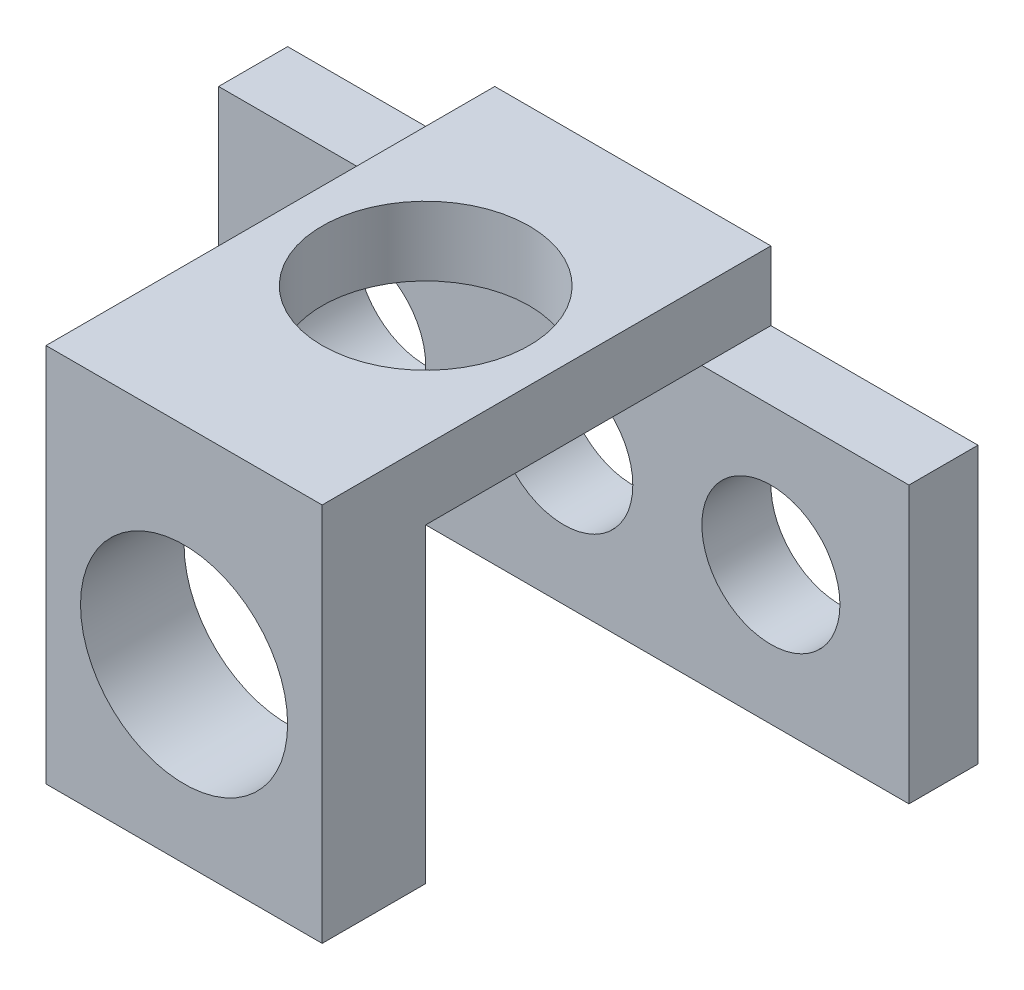
ISO-10303-21;
HEADER;
FILE_DESCRIPTION(('STEP AP214'),'2;1');
FILE_NAME('part.step','',(''),(''),'','','');
FILE_SCHEMA(('AUTOMOTIVE_DESIGN { 1 0 10303 214 1 1 1 1 }'));
ENDSEC;
DATA;
#1=APPLICATION_CONTEXT('core data for automotive mechanical design processes');
#2=APPLICATION_PROTOCOL_DEFINITION('international standard','automotive_design',2000,#1);
#3=PRODUCT_CONTEXT('',#1,'mechanical');
#4=PRODUCT('Part','Part','',(#3));
#5=PRODUCT_RELATED_PRODUCT_CATEGORY('part','',(#4));
#6=PRODUCT_DEFINITION_FORMATION('','',#4);
#7=PRODUCT_DEFINITION_CONTEXT('part definition',#1,'design');
#8=PRODUCT_DEFINITION('design','',#6,#7);
#9=PRODUCT_DEFINITION_SHAPE('','',#8);
#10=(LENGTH_UNIT() NAMED_UNIT(*) SI_UNIT(.MILLI.,.METRE.));
#11=(NAMED_UNIT(*) PLANE_ANGLE_UNIT() SI_UNIT($,.RADIAN.));
#12=(NAMED_UNIT(*) SI_UNIT($,.STERADIAN.) SOLID_ANGLE_UNIT());
#13=UNCERTAINTY_MEASURE_WITH_UNIT(LENGTH_MEASURE(1.E-05),#10,'distance_accuracy_value','');
#14=(GEOMETRIC_REPRESENTATION_CONTEXT(3) GLOBAL_UNCERTAINTY_ASSIGNED_CONTEXT((#13)) GLOBAL_UNIT_ASSIGNED_CONTEXT((#10,
#11,#12)) REPRESENTATION_CONTEXT('',''));
#15=CARTESIAN_POINT('',(0.,0.,0.));
#16=DIRECTION('',(0.,0.,1.));
#17=DIRECTION('',(1.,0.,0.));
#18=AXIS2_PLACEMENT_3D('',#15,#16,#17);
#19=CARTESIAN_POINT('',(-20.,40.,55.));
#20=DIRECTION('',(0.,1.,0.));
#21=DIRECTION('',(0.,0.,1.));
#22=AXIS2_PLACEMENT_3D('',#19,#20,#21);
#23=PLANE('',#22);
#24=CARTESIAN_POINT('',(0.,40.,20.));
#25=DIRECTION('',(0.,1.,0.));
#26=DIRECTION('',(0.,0.,1.));
#27=AXIS2_PLACEMENT_3D('',#24,#25,#26);
#28=CIRCLE('',#27,15.);
#29=CARTESIAN_POINT('',(0.,40.,35.));
#30=VERTEX_POINT('',#29);
#31=EDGE_CURVE('E237',#30,#30,#28,.T.);
#32=ORIENTED_EDGE('',*,*,#31,.T.);
#33=EDGE_LOOP('',(#32));
#34=FACE_BOUND('',#33,.T.);
#35=DIRECTION('',(1.,0.,0.));
#36=VECTOR('',#35,1.);
#37=CARTESIAN_POINT('',(-20.,40.,40.));
#38=LINE('',#37,#36);
#39=CARTESIAN_POINT('',(-20.,40.,40.));
#40=VERTEX_POINT('',#39);
#41=CARTESIAN_POINT('',(20.,40.,40.));
#42=VERTEX_POINT('',#41);
#43=EDGE_CURVE('E150',#40,#42,#38,.T.);
#44=ORIENTED_EDGE('',*,*,#43,.F.);
#45=DIRECTION('',(0.,0.,-1.));
#46=VECTOR('',#45,1.);
#47=CARTESIAN_POINT('',(-20.,40.,55.));
#48=LINE('',#47,#46);
#49=CARTESIAN_POINT('',(-20.,40.,0.));
#50=VERTEX_POINT('',#49);
#51=EDGE_CURVE('E154',#40,#50,#48,.T.);
#52=ORIENTED_EDGE('',*,*,#51,.T.);
#53=DIRECTION('',(1.,0.,0.));
#54=VECTOR('',#53,1.);
#55=CARTESIAN_POINT('',(-50.,40.,0.));
#56=LINE('',#55,#54);
#57=CARTESIAN_POINT('',(20.,40.,0.));
#58=VERTEX_POINT('',#57);
#59=EDGE_CURVE('E184',#50,#58,#56,.T.);
#60=ORIENTED_EDGE('',*,*,#59,.T.);
#61=DIRECTION('',(0.,0.,-1.));
#62=VECTOR('',#61,1.);
#63=CARTESIAN_POINT('',(20.,40.,55.));
#64=LINE('',#63,#62);
#65=EDGE_CURVE('E44',#42,#58,#64,.T.);
#66=ORIENTED_EDGE('',*,*,#65,.F.);
#67=EDGE_LOOP('',(#44,#52,#60,#66));
#68=FACE_BOUND('',#67,.T.);
#69=ADVANCED_FACE('F33',(#34,#68),#23,.F.);
#70=CARTESIAN_POINT('',(0.,40.,0.));
#71=DIRECTION('',(0.,1.,0.));
#72=DIRECTION('',(0.,0.,1.));
#73=AXIS2_PLACEMENT_3D('',#70,#71,#72);
#74=PLANE('',#73);
#75=CARTESIAN_POINT('',(-50.,40.,0.));
#76=VERTEX_POINT('',#75);
#77=EDGE_CURVE('E89',#76,#50,#56,.T.);
#78=ORIENTED_EDGE('',*,*,#77,.T.);
#79=CARTESIAN_POINT('',(-20.,40.,-10.));
#80=VERTEX_POINT('',#79);
#81=EDGE_CURVE('E42',#50,#80,#48,.T.);
#82=ORIENTED_EDGE('',*,*,#81,.T.);
#83=DIRECTION('',(-1.,0.,0.));
#84=VECTOR('',#83,1.);
#85=CARTESIAN_POINT('',(50.,40.,-10.));
#86=LINE('',#85,#84);
#87=CARTESIAN_POINT('',(-50.,40.,-10.));
#88=VERTEX_POINT('',#87);
#89=EDGE_CURVE('E59',#80,#88,#86,.T.);
#90=ORIENTED_EDGE('',*,*,#89,.T.);
#91=DIRECTION('',(0.,0.,1.));
#92=VECTOR('',#91,1.);
#93=CARTESIAN_POINT('',(-50.,40.,-10.));
#94=LINE('',#93,#92);
#95=EDGE_CURVE('E179',#88,#76,#94,.T.);
#96=ORIENTED_EDGE('',*,*,#95,.T.);
#97=EDGE_LOOP('',(#78,#82,#90,#96));
#98=FACE_BOUND('',#97,.T.);
#99=ADVANCED_FACE('F204',(#98),#74,.T.);
#100=CARTESIAN_POINT('',(-50.,40.,-10.));
#101=DIRECTION('',(1.,0.,0.));
#102=DIRECTION('',(0.,0.,-1.));
#103=AXIS2_PLACEMENT_3D('',#100,#101,#102);
#104=PLANE('',#103);
#105=DIRECTION('',(0.,0.,1.));
#106=VECTOR('',#105,1.);
#107=CARTESIAN_POINT('',(-50.,0.,-10.));
#108=LINE('',#107,#106);
#109=CARTESIAN_POINT('',(-50.,0.,-10.));
#110=VERTEX_POINT('',#109);
#111=CARTESIAN_POINT('',(-50.,0.,0.));
#112=VERTEX_POINT('',#111);
#113=EDGE_CURVE('E178',#110,#112,#108,.T.);
#114=ORIENTED_EDGE('',*,*,#113,.T.);
#115=DIRECTION('',(0.,-1.,0.));
#116=VECTOR('',#115,1.);
#117=CARTESIAN_POINT('',(-50.,40.,0.));
#118=LINE('',#117,#116);
#119=EDGE_CURVE('E202',#76,#112,#118,.T.);
#120=ORIENTED_EDGE('',*,*,#119,.F.);
#121=ORIENTED_EDGE('',*,*,#95,.F.);
#122=DIRECTION('',(0.,-1.,0.));
#123=VECTOR('',#122,1.);
#124=CARTESIAN_POINT('',(-50.,40.,-10.));
#125=LINE('',#124,#123);
#126=EDGE_CURVE('E189',#88,#110,#125,.T.);
#127=ORIENTED_EDGE('',*,*,#126,.T.);
#128=EDGE_LOOP('',(#114,#120,#121,#127));
#129=FACE_BOUND('',#128,.T.);
#130=ADVANCED_FACE('F35',(#129),#104,.F.);
#131=CARTESIAN_POINT('',(-50.,40.,0.));
#132=DIRECTION('',(0.,0.,-1.));
#133=DIRECTION('',(-1.,0.,0.));
#134=AXIS2_PLACEMENT_3D('',#131,#132,#133);
#135=PLANE('',#134);
#136=CARTESIAN_POINT('',(-30.,20.,0.));
#137=DIRECTION('',(0.,0.,1.));
#138=DIRECTION('',(1.,0.,0.));
#139=AXIS2_PLACEMENT_3D('',#136,#137,#138);
#140=CIRCLE('',#139,10.);
#141=CARTESIAN_POINT('',(-20.,20.,0.));
#142=VERTEX_POINT('',#141);
#143=EDGE_CURVE('E228',#142,#142,#140,.T.);
#144=ORIENTED_EDGE('',*,*,#143,.F.);
#145=EDGE_LOOP('',(#144));
#146=FACE_BOUND('',#145,.T.);
#147=CARTESIAN_POINT('',(30.,20.,0.));
#148=DIRECTION('',(0.,0.,1.));
#149=DIRECTION('',(1.,0.,0.));
#150=AXIS2_PLACEMENT_3D('',#147,#148,#149);
#151=CIRCLE('',#150,10.);
#152=CARTESIAN_POINT('',(40.,20.,0.));
#153=VERTEX_POINT('',#152);
#154=EDGE_CURVE('E240',#153,#153,#151,.T.);
#155=ORIENTED_EDGE('',*,*,#154,.F.);
#156=EDGE_LOOP('',(#155));
#157=FACE_BOUND('',#156,.T.);
#158=CARTESIAN_POINT('',(0.,20.,0.));
#159=DIRECTION('',(0.,0.,1.));
#160=DIRECTION('',(1.,0.,0.));
#161=AXIS2_PLACEMENT_3D('',#158,#159,#160);
#162=CIRCLE('',#161,10.);
#163=CARTESIAN_POINT('',(10.,20.,0.));
#164=VERTEX_POINT('',#163);
#165=EDGE_CURVE('E233',#164,#164,#162,.T.);
#166=ORIENTED_EDGE('',*,*,#165,.F.);
#167=EDGE_LOOP('',(#166));
#168=FACE_BOUND('',#167,.T.);
#169=DIRECTION('',(1.,0.,0.));
#170=VECTOR('',#169,1.);
#171=CARTESIAN_POINT('',(-50.,0.,0.));
#172=LINE('',#171,#170);
#173=CARTESIAN_POINT('',(50.,0.,0.));
#174=VERTEX_POINT('',#173);
#175=EDGE_CURVE('E192',#112,#174,#172,.T.);
#176=ORIENTED_EDGE('',*,*,#175,.T.);
#177=DIRECTION('',(0.,-1.,0.));
#178=VECTOR('',#177,1.);
#179=CARTESIAN_POINT('',(50.,40.,0.));
#180=LINE('',#179,#178);
#181=CARTESIAN_POINT('',(50.,40.,0.));
#182=VERTEX_POINT('',#181);
#183=EDGE_CURVE('E200',#182,#174,#180,.T.);
#184=ORIENTED_EDGE('',*,*,#183,.F.);
#185=EDGE_CURVE('E181',#58,#182,#56,.T.);
#186=ORIENTED_EDGE('',*,*,#185,.F.);
#187=ORIENTED_EDGE('',*,*,#59,.F.);
#188=ORIENTED_EDGE('',*,*,#77,.F.);
#189=ORIENTED_EDGE('',*,*,#119,.T.);
#190=EDGE_LOOP('',(#176,#184,#186,#187,#188,#189));
#191=FACE_BOUND('',#190,.T.);
#192=ADVANCED_FACE('F213',(#146,#157,#168,#191),#135,.F.);
#193=CARTESIAN_POINT('',(50.,40.,0.));
#194=DIRECTION('',(-1.,0.,0.));
#195=DIRECTION('',(0.,0.,1.));
#196=AXIS2_PLACEMENT_3D('',#193,#194,#195);
#197=PLANE('',#196);
#198=DIRECTION('',(0.,0.,-1.));
#199=VECTOR('',#198,1.);
#200=CARTESIAN_POINT('',(50.,0.,0.));
#201=LINE('',#200,#199);
#202=CARTESIAN_POINT('',(50.,0.,-10.));
#203=VERTEX_POINT('',#202);
#204=EDGE_CURVE('E194',#174,#203,#201,.T.);
#205=ORIENTED_EDGE('',*,*,#204,.T.);
#206=DIRECTION('',(0.,-1.,0.));
#207=VECTOR('',#206,1.);
#208=CARTESIAN_POINT('',(50.,40.,-10.));
#209=LINE('',#208,#207);
#210=CARTESIAN_POINT('',(50.,40.,-10.));
#211=VERTEX_POINT('',#210);
#212=EDGE_CURVE('E198',#211,#203,#209,.T.);
#213=ORIENTED_EDGE('',*,*,#212,.F.);
#214=DIRECTION('',(0.,0.,-1.));
#215=VECTOR('',#214,1.);
#216=CARTESIAN_POINT('',(50.,40.,0.));
#217=LINE('',#216,#215);
#218=EDGE_CURVE('E183',#182,#211,#217,.T.);
#219=ORIENTED_EDGE('',*,*,#218,.F.);
#220=ORIENTED_EDGE('',*,*,#183,.T.);
#221=EDGE_LOOP('',(#205,#213,#219,#220));
#222=FACE_BOUND('',#221,.T.);
#223=ADVANCED_FACE('F217',(#222),#197,.F.);
#224=CARTESIAN_POINT('',(50.,40.,-10.));
#225=DIRECTION('',(0.,0.,1.));
#226=DIRECTION('',(1.,0.,0.));
#227=AXIS2_PLACEMENT_3D('',#224,#225,#226);
#228=PLANE('',#227);
#229=CARTESIAN_POINT('',(-30.,20.,-10.));
#230=DIRECTION('',(0.,0.,1.));
#231=DIRECTION('',(1.,0.,0.));
#232=AXIS2_PLACEMENT_3D('',#229,#230,#231);
#233=CIRCLE('',#232,10.);
#234=CARTESIAN_POINT('',(-20.,20.,-10.));
#235=VERTEX_POINT('',#234);
#236=EDGE_CURVE('E226',#235,#235,#233,.T.);
#237=ORIENTED_EDGE('',*,*,#236,.T.);
#238=EDGE_LOOP('',(#237));
#239=FACE_BOUND('',#238,.T.);
#240=CARTESIAN_POINT('',(30.,20.,-10.));
#241=DIRECTION('',(0.,0.,1.));
#242=DIRECTION('',(1.,0.,0.));
#243=AXIS2_PLACEMENT_3D('',#240,#241,#242);
#244=CIRCLE('',#243,10.);
#245=CARTESIAN_POINT('',(40.,20.,-10.));
#246=VERTEX_POINT('',#245);
#247=EDGE_CURVE('E243',#246,#246,#244,.T.);
#248=ORIENTED_EDGE('',*,*,#247,.T.);
#249=EDGE_LOOP('',(#248));
#250=FACE_BOUND('',#249,.T.);
#251=CARTESIAN_POINT('',(0.,20.,-10.));
#252=DIRECTION('',(0.,0.,1.));
#253=DIRECTION('',(1.,0.,0.));
#254=AXIS2_PLACEMENT_3D('',#251,#252,#253);
#255=CIRCLE('',#254,10.);
#256=CARTESIAN_POINT('',(10.,20.,-10.));
#257=VERTEX_POINT('',#256);
#258=EDGE_CURVE('E236',#257,#257,#255,.T.);
#259=ORIENTED_EDGE('',*,*,#258,.T.);
#260=EDGE_LOOP('',(#259));
#261=FACE_BOUND('',#260,.T.);
#262=DIRECTION('',(-1.,0.,0.));
#263=VECTOR('',#262,1.);
#264=CARTESIAN_POINT('',(50.,0.,-10.));
#265=LINE('',#264,#263);
#266=EDGE_CURVE('E81',#203,#110,#265,.T.);
#267=ORIENTED_EDGE('',*,*,#266,.T.);
#268=ORIENTED_EDGE('',*,*,#126,.F.);
#269=ORIENTED_EDGE('',*,*,#89,.F.);
#270=DIRECTION('',(0.,-1.,0.));
#271=VECTOR('',#270,1.);
#272=CARTESIAN_POINT('',(-20.,50.,-10.));
#273=LINE('',#272,#271);
#274=CARTESIAN_POINT('',(-20.,50.,-10.));
#275=VERTEX_POINT('',#274);
#276=EDGE_CURVE('E51',#275,#80,#273,.T.);
#277=ORIENTED_EDGE('',*,*,#276,.F.);
#278=DIRECTION('',(-1.,0.,0.));
#279=VECTOR('',#278,1.);
#280=CARTESIAN_POINT('',(20.,50.,-10.));
#281=LINE('',#280,#279);
#282=CARTESIAN_POINT('',(20.,50.,-10.));
#283=VERTEX_POINT('',#282);
#284=EDGE_CURVE('E158',#283,#275,#281,.T.);
#285=ORIENTED_EDGE('',*,*,#284,.F.);
#286=DIRECTION('',(0.,1.,0.));
#287=VECTOR('',#286,1.);
#288=CARTESIAN_POINT('',(20.,40.,-10.));
#289=LINE('',#288,#287);
#290=CARTESIAN_POINT('',(20.,40.,-10.));
#291=VERTEX_POINT('',#290);
#292=EDGE_CURVE('E155',#291,#283,#289,.T.);
#293=ORIENTED_EDGE('',*,*,#292,.F.);
#294=EDGE_CURVE('E186',#211,#291,#86,.T.);
#295=ORIENTED_EDGE('',*,*,#294,.F.);
#296=ORIENTED_EDGE('',*,*,#212,.T.);
#297=EDGE_LOOP('',(#267,#268,#269,#277,#285,#293,#295,#296));
#298=FACE_BOUND('',#297,.T.);
#299=ADVANCED_FACE('F205',(#239,#250,#261,#298),#228,.F.);
#300=EDGE_CURVE('E11',#58,#291,#64,.T.);
#301=ORIENTED_EDGE('',*,*,#300,.F.);
#302=ORIENTED_EDGE('',*,*,#185,.T.);
#303=ORIENTED_EDGE('',*,*,#218,.T.);
#304=ORIENTED_EDGE('',*,*,#294,.T.);
#305=EDGE_LOOP('',(#301,#302,#303,#304));
#306=FACE_BOUND('',#305,.T.);
#307=ADVANCED_FACE('F222',(#306),#74,.T.);
#308=CARTESIAN_POINT('',(0.,0.,0.));
#309=DIRECTION('',(0.,1.,0.));
#310=DIRECTION('',(0.,0.,1.));
#311=AXIS2_PLACEMENT_3D('',#308,#309,#310);
#312=PLANE('',#311);
#313=ORIENTED_EDGE('',*,*,#113,.F.);
#314=ORIENTED_EDGE('',*,*,#266,.F.);
#315=ORIENTED_EDGE('',*,*,#204,.F.);
#316=ORIENTED_EDGE('',*,*,#175,.F.);
#317=EDGE_LOOP('',(#313,#314,#315,#316));
#318=FACE_BOUND('',#317,.T.);
#319=ADVANCED_FACE('F210',(#318),#312,.F.);
#320=CARTESIAN_POINT('',(20.,40.,55.));
#321=DIRECTION('',(-1.,0.,0.));
#322=DIRECTION('',(0.,0.,1.));
#323=AXIS2_PLACEMENT_3D('',#320,#321,#322);
#324=PLANE('',#323);
#325=ORIENTED_EDGE('',*,*,#292,.T.);
#326=DIRECTION('',(0.,0.,-1.));
#327=VECTOR('',#326,1.);
#328=CARTESIAN_POINT('',(20.,50.,55.));
#329=LINE('',#328,#327);
#330=CARTESIAN_POINT('',(20.,50.,55.));
#331=VERTEX_POINT('',#330);
#332=EDGE_CURVE('E175',#331,#283,#329,.T.);
#333=ORIENTED_EDGE('',*,*,#332,.F.);
#334=DIRECTION('',(0.,1.,0.));
#335=VECTOR('',#334,1.);
#336=CARTESIAN_POINT('',(20.,40.,55.));
#337=LINE('',#336,#335);
#338=CARTESIAN_POINT('',(20.,-4.99999999999998,55.));
#339=VERTEX_POINT('',#338);
#340=EDGE_CURVE('E163',#339,#331,#337,.T.);
#341=ORIENTED_EDGE('',*,*,#340,.F.);
#342=DIRECTION('',(0.,0.,1.));
#343=VECTOR('',#342,1.);
#344=CARTESIAN_POINT('',(20.,-4.99999999999998,55.));
#345=LINE('',#344,#343);
#346=CARTESIAN_POINT('',(20.,-4.99999999999998,40.));
#347=VERTEX_POINT('',#346);
#348=EDGE_CURVE('E141',#347,#339,#345,.T.);
#349=ORIENTED_EDGE('',*,*,#348,.F.);
#350=DIRECTION('',(0.,1.,0.));
#351=VECTOR('',#350,1.);
#352=CARTESIAN_POINT('',(20.,-4.99999999999998,40.));
#353=LINE('',#352,#351);
#354=EDGE_CURVE('E137',#347,#42,#353,.T.);
#355=ORIENTED_EDGE('',*,*,#354,.T.);
#356=ORIENTED_EDGE('',*,*,#65,.T.);
#357=ORIENTED_EDGE('',*,*,#300,.T.);
#358=EDGE_LOOP('',(#325,#333,#341,#349,#355,#356,#357));
#359=FACE_BOUND('',#358,.T.);
#360=ADVANCED_FACE('F287',(#359),#324,.F.);
#361=CARTESIAN_POINT('',(20.,50.,55.));
#362=DIRECTION('',(0.,-1.,0.));
#363=DIRECTION('',(0.,0.,-1.));
#364=AXIS2_PLACEMENT_3D('',#361,#362,#363);
#365=PLANE('',#364);
#366=CARTESIAN_POINT('',(0.,50.,20.));
#367=DIRECTION('',(0.,1.,0.));
#368=DIRECTION('',(0.,0.,1.));
#369=AXIS2_PLACEMENT_3D('',#366,#367,#368);
#370=CIRCLE('',#369,15.);
#371=CARTESIAN_POINT('',(0.,50.,35.));
#372=VERTEX_POINT('',#371);
#373=EDGE_CURVE('E250',#372,#372,#370,.T.);
#374=ORIENTED_EDGE('',*,*,#373,.F.);
#375=EDGE_LOOP('',(#374));
#376=FACE_BOUND('',#375,.T.);
#377=ORIENTED_EDGE('',*,*,#284,.T.);
#378=DIRECTION('',(0.,0.,-1.));
#379=VECTOR('',#378,1.);
#380=CARTESIAN_POINT('',(-20.,50.,55.));
#381=LINE('',#380,#379);
#382=CARTESIAN_POINT('',(-20.,50.,55.));
#383=VERTEX_POINT('',#382);
#384=EDGE_CURVE('E173',#383,#275,#381,.T.);
#385=ORIENTED_EDGE('',*,*,#384,.F.);
#386=DIRECTION('',(-1.,0.,0.));
#387=VECTOR('',#386,1.);
#388=CARTESIAN_POINT('',(20.,50.,55.));
#389=LINE('',#388,#387);
#390=EDGE_CURVE('E166',#331,#383,#389,.T.);
#391=ORIENTED_EDGE('',*,*,#390,.F.);
#392=ORIENTED_EDGE('',*,*,#332,.T.);
#393=EDGE_LOOP('',(#377,#385,#391,#392));
#394=FACE_BOUND('',#393,.T.);
#395=ADVANCED_FACE('F284',(#376,#394),#365,.F.);
#396=CARTESIAN_POINT('',(-20.,50.,55.));
#397=DIRECTION('',(1.,0.,0.));
#398=DIRECTION('',(0.,1.,0.));
#399=AXIS2_PLACEMENT_3D('',#396,#397,#398);
#400=PLANE('',#399);
#401=ORIENTED_EDGE('',*,*,#276,.T.);
#402=ORIENTED_EDGE('',*,*,#81,.F.);
#403=ORIENTED_EDGE('',*,*,#51,.F.);
#404=DIRECTION('',(0.,1.,0.));
#405=VECTOR('',#404,1.);
#406=CARTESIAN_POINT('',(-20.,-4.99999999999998,40.));
#407=LINE('',#406,#405);
#408=CARTESIAN_POINT('',(-20.,-4.99999999999998,40.));
#409=VERTEX_POINT('',#408);
#410=EDGE_CURVE('E134',#409,#40,#407,.T.);
#411=ORIENTED_EDGE('',*,*,#410,.F.);
#412=DIRECTION('',(0.,0.,-1.));
#413=VECTOR('',#412,1.);
#414=CARTESIAN_POINT('',(-20.,-4.99999999999998,40.));
#415=LINE('',#414,#413);
#416=CARTESIAN_POINT('',(-20.,-4.99999999999998,55.));
#417=VERTEX_POINT('',#416);
#418=EDGE_CURVE('E142',#417,#409,#415,.T.);
#419=ORIENTED_EDGE('',*,*,#418,.F.);
#420=DIRECTION('',(0.,-1.,0.));
#421=VECTOR('',#420,1.);
#422=CARTESIAN_POINT('',(-20.,50.,55.));
#423=LINE('',#422,#421);
#424=EDGE_CURVE('E168',#383,#417,#423,.T.);
#425=ORIENTED_EDGE('',*,*,#424,.F.);
#426=ORIENTED_EDGE('',*,*,#384,.T.);
#427=EDGE_LOOP('',(#401,#402,#403,#411,#419,#425,#426));
#428=FACE_BOUND('',#427,.T.);
#429=ADVANCED_FACE('F153',(#428),#400,.F.);
#430=CARTESIAN_POINT('',(0.,0.,55.));
#431=DIRECTION('',(0.,0.,1.));
#432=DIRECTION('',(1.,0.,0.));
#433=AXIS2_PLACEMENT_3D('',#430,#431,#432);
#434=PLANE('',#433);
#435=CARTESIAN_POINT('',(0.,20.,55.));
#436=DIRECTION('',(0.,0.,1.));
#437=DIRECTION('',(1.,0.,0.));
#438=AXIS2_PLACEMENT_3D('',#435,#436,#437);
#439=CIRCLE('',#438,15.);
#440=CARTESIAN_POINT('',(15.,20.,55.));
#441=VERTEX_POINT('',#440);
#442=EDGE_CURVE('E253',#441,#441,#439,.T.);
#443=ORIENTED_EDGE('',*,*,#442,.F.);
#444=EDGE_LOOP('',(#443));
#445=FACE_BOUND('',#444,.T.);
#446=ORIENTED_EDGE('',*,*,#340,.T.);
#447=ORIENTED_EDGE('',*,*,#390,.T.);
#448=ORIENTED_EDGE('',*,*,#424,.T.);
#449=DIRECTION('',(-1.,0.,0.));
#450=VECTOR('',#449,1.);
#451=CARTESIAN_POINT('',(-20.,-4.99999999999998,55.));
#452=LINE('',#451,#450);
#453=EDGE_CURVE('E148',#339,#417,#452,.T.);
#454=ORIENTED_EDGE('',*,*,#453,.F.);
#455=EDGE_LOOP('',(#446,#447,#448,#454));
#456=FACE_BOUND('',#455,.T.);
#457=ADVANCED_FACE('F280',(#445,#456),#434,.T.);
#458=CARTESIAN_POINT('',(-20.,-4.99999999999998,40.));
#459=DIRECTION('',(0.,0.,1.));
#460=DIRECTION('',(1.,0.,0.));
#461=AXIS2_PLACEMENT_3D('',#458,#459,#460);
#462=PLANE('',#461);
#463=CARTESIAN_POINT('',(0.,20.,40.));
#464=DIRECTION('',(0.,0.,1.));
#465=DIRECTION('',(1.,0.,0.));
#466=AXIS2_PLACEMENT_3D('',#463,#464,#465);
#467=CIRCLE('',#466,15.);
#468=CARTESIAN_POINT('',(15.,20.,40.));
#469=VERTEX_POINT('',#468);
#470=EDGE_CURVE('E37',#469,#469,#467,.T.);
#471=ORIENTED_EDGE('',*,*,#470,.T.);
#472=EDGE_LOOP('',(#471));
#473=FACE_BOUND('',#472,.T.);
#474=ORIENTED_EDGE('',*,*,#43,.T.);
#475=ORIENTED_EDGE('',*,*,#354,.F.);
#476=DIRECTION('',(1.,0.,0.));
#477=VECTOR('',#476,1.);
#478=CARTESIAN_POINT('',(-20.,-4.99999999999998,40.));
#479=LINE('',#478,#477);
#480=EDGE_CURVE('E130',#409,#347,#479,.T.);
#481=ORIENTED_EDGE('',*,*,#480,.F.);
#482=ORIENTED_EDGE('',*,*,#410,.T.);
#483=EDGE_LOOP('',(#474,#475,#481,#482));
#484=FACE_BOUND('',#483,.T.);
#485=ADVANCED_FACE('F132',(#473,#484),#462,.F.);
#486=CARTESIAN_POINT('',(0.,-4.99999999999998,0.));
#487=DIRECTION('',(0.,1.,0.));
#488=DIRECTION('',(0.,0.,1.));
#489=AXIS2_PLACEMENT_3D('',#486,#487,#488);
#490=PLANE('',#489);
#491=ORIENTED_EDGE('',*,*,#418,.T.);
#492=ORIENTED_EDGE('',*,*,#480,.T.);
#493=ORIENTED_EDGE('',*,*,#348,.T.);
#494=ORIENTED_EDGE('',*,*,#453,.T.);
#495=EDGE_LOOP('',(#491,#492,#493,#494));
#496=FACE_BOUND('',#495,.T.);
#497=ADVANCED_FACE('F146',(#496),#490,.F.);
#498=CARTESIAN_POINT('',(0.,20.,-10.));
#499=DIRECTION('',(0.,0.,1.));
#500=DIRECTION('',(1.,0.,0.));
#501=AXIS2_PLACEMENT_3D('',#498,#499,#500);
#502=CYLINDRICAL_SURFACE('',#501,10.);
#503=ORIENTED_EDGE('',*,*,#258,.F.);
#504=EDGE_LOOP('',(#503));
#505=FACE_BOUND('',#504,.T.);
#506=ORIENTED_EDGE('',*,*,#165,.T.);
#507=EDGE_LOOP('',(#506));
#508=FACE_BOUND('',#507,.T.);
#509=ADVANCED_FACE('F310',(#505,#508),#502,.F.);
#510=CARTESIAN_POINT('',(30.,20.,-10.));
#511=DIRECTION('',(0.,0.,1.));
#512=DIRECTION('',(1.,0.,0.));
#513=AXIS2_PLACEMENT_3D('',#510,#511,#512);
#514=CYLINDRICAL_SURFACE('',#513,10.);
#515=ORIENTED_EDGE('',*,*,#247,.F.);
#516=EDGE_LOOP('',(#515));
#517=FACE_BOUND('',#516,.T.);
#518=ORIENTED_EDGE('',*,*,#154,.T.);
#519=EDGE_LOOP('',(#518));
#520=FACE_BOUND('',#519,.T.);
#521=ADVANCED_FACE('F312',(#517,#520),#514,.F.);
#522=CARTESIAN_POINT('',(-30.,20.,-10.));
#523=DIRECTION('',(0.,0.,1.));
#524=DIRECTION('',(1.,0.,0.));
#525=AXIS2_PLACEMENT_3D('',#522,#523,#524);
#526=CYLINDRICAL_SURFACE('',#525,10.);
#527=ORIENTED_EDGE('',*,*,#236,.F.);
#528=EDGE_LOOP('',(#527));
#529=FACE_BOUND('',#528,.T.);
#530=ORIENTED_EDGE('',*,*,#143,.T.);
#531=EDGE_LOOP('',(#530));
#532=FACE_BOUND('',#531,.T.);
#533=ADVANCED_FACE('F268',(#529,#532),#526,.F.);
#534=CARTESIAN_POINT('',(0.,5.00000000000002,20.));
#535=DIRECTION('',(0.,1.,0.));
#536=DIRECTION('',(0.,0.,1.));
#537=AXIS2_PLACEMENT_3D('',#534,#535,#536);
#538=CYLINDRICAL_SURFACE('',#537,15.);
#539=CARTESIAN_POINT('',(0.,50.,35.));
#540=CARTESIAN_POINT('',(0.,49.8958333333333,35.));
#541=CARTESIAN_POINT('',(0.,49.7916666666667,35.));
#542=CARTESIAN_POINT('',(0.,49.5833333333333,35.));
#543=CARTESIAN_POINT('',(0.,49.4791666666667,35.));
#544=CARTESIAN_POINT('',(0.,49.2708333333333,35.));
#545=CARTESIAN_POINT('',(0.,49.1666666666667,35.));
#546=CARTESIAN_POINT('',(0.,48.9583333333333,35.));
#547=CARTESIAN_POINT('',(0.,48.8541666666667,35.));
#548=CARTESIAN_POINT('',(0.,48.6458333333333,35.));
#549=CARTESIAN_POINT('',(0.,48.5416666666667,35.));
#550=CARTESIAN_POINT('',(0.,48.3333333333333,35.));
#551=CARTESIAN_POINT('',(0.,48.2291666666667,35.));
#552=CARTESIAN_POINT('',(0.,48.0208333333333,35.));
#553=CARTESIAN_POINT('',(0.,47.9166666666667,35.));
#554=CARTESIAN_POINT('',(0.,47.7083333333333,35.));
#555=CARTESIAN_POINT('',(0.,47.6041666666667,35.));
#556=CARTESIAN_POINT('',(0.,47.3958333333333,35.));
#557=CARTESIAN_POINT('',(0.,47.2916666666667,35.));
#558=CARTESIAN_POINT('',(0.,47.0833333333333,35.));
#559=CARTESIAN_POINT('',(0.,46.9791666666667,35.));
#560=CARTESIAN_POINT('',(0.,46.7708333333333,35.));
#561=CARTESIAN_POINT('',(0.,46.6666666666667,35.));
#562=CARTESIAN_POINT('',(0.,46.4583333333333,35.));
#563=CARTESIAN_POINT('',(0.,46.3541666666667,35.));
#564=CARTESIAN_POINT('',(0.,46.1458333333333,35.));
#565=CARTESIAN_POINT('',(0.,46.0416666666667,35.));
#566=CARTESIAN_POINT('',(0.,45.8333333333333,35.));
#567=CARTESIAN_POINT('',(0.,45.7291666666667,35.));
#568=CARTESIAN_POINT('',(0.,45.5208333333333,35.));
#569=CARTESIAN_POINT('',(0.,45.4166666666667,35.));
#570=CARTESIAN_POINT('',(0.,45.2083333333333,35.));
#571=CARTESIAN_POINT('',(0.,45.1041666666667,35.));
#572=CARTESIAN_POINT('',(0.,44.8958333333333,35.));
#573=CARTESIAN_POINT('',(0.,44.7916666666667,35.));
#574=CARTESIAN_POINT('',(0.,44.5833333333333,35.));
#575=CARTESIAN_POINT('',(0.,44.4791666666667,35.));
#576=CARTESIAN_POINT('',(0.,44.2708333333333,35.));
#577=CARTESIAN_POINT('',(0.,44.1666666666667,35.));
#578=CARTESIAN_POINT('',(0.,43.9583333333333,35.));
#579=CARTESIAN_POINT('',(0.,43.8541666666667,35.));
#580=CARTESIAN_POINT('',(0.,43.6458333333333,35.));
#581=CARTESIAN_POINT('',(0.,43.5416666666667,35.));
#582=CARTESIAN_POINT('',(0.,43.3333333333333,35.));
#583=CARTESIAN_POINT('',(0.,43.2291666666667,35.));
#584=CARTESIAN_POINT('',(0.,43.0208333333333,35.));
#585=CARTESIAN_POINT('',(0.,42.9166666666667,35.));
#586=CARTESIAN_POINT('',(0.,42.7083333333334,35.));
#587=CARTESIAN_POINT('',(0.,42.6041666666667,35.));
#588=CARTESIAN_POINT('',(0.,42.3958333333334,35.));
#589=CARTESIAN_POINT('',(0.,42.2916666666667,35.));
#590=CARTESIAN_POINT('',(0.,42.0833333333334,35.));
#591=CARTESIAN_POINT('',(0.,41.9791666666667,35.));
#592=CARTESIAN_POINT('',(0.,41.7708333333334,35.));
#593=CARTESIAN_POINT('',(0.,41.6666666666667,35.));
#594=CARTESIAN_POINT('',(0.,41.4583333333334,35.));
#595=CARTESIAN_POINT('',(0.,41.3541666666667,35.));
#596=CARTESIAN_POINT('',(0.,41.1458333333334,35.));
#597=CARTESIAN_POINT('',(0.,41.0416666666667,35.));
#598=CARTESIAN_POINT('',(0.,40.8333333333333,35.));
#599=CARTESIAN_POINT('',(0.,40.7291666666667,35.));
#600=CARTESIAN_POINT('',(0.,40.5208333333333,35.));
#601=CARTESIAN_POINT('',(0.,40.4166666666667,35.));
#602=CARTESIAN_POINT('',(0.,40.2083333333333,35.));
#603=CARTESIAN_POINT('',(0.,40.1041666666667,35.));
#604=CARTESIAN_POINT('',(0.,40.,35.));
#605=B_SPLINE_CURVE_WITH_KNOTS('',3,(#539,#540,#541,#542,#543,#544,#545,#546,#547,#548,#549,
#550,#551,#552,#553,#554,#555,#556,#557,#558,#559,#560,#561,#562,#563,#564,#565,#566,#567,#568,
#569,#570,#571,#572,#573,#574,#575,#576,#577,#578,#579,#580,#581,#582,#583,#584,#585,#586,#587,
#588,#589,#590,#591,#592,#593,#594,#595,#596,#597,#598,#599,#600,#601,#602,#603,#604),
.UNSPECIFIED.,.F.,.F.,(4,2,2,2,2,2,2,2,2,2,2,2,2,2,2,2,2,2,2,2,2,2,2,2,2,2,2,2,2,2,2,2,4),(0.,
0.3125,0.625000000000001,0.937500000000001,1.25,1.5625,1.875,2.1875,2.5,2.8125,3.125,3.4375,
3.75,4.0625,4.375,4.6875,5.,5.3125,5.625,5.9375,6.25,6.5625,6.875,7.1875,7.49999999999999,
7.8125,8.12499999999999,8.43749999999999,8.74999999999999,9.06249999999999,9.37499999999999,
9.68749999999999,9.99999999999999),.UNSPECIFIED.);
#606=EDGE_CURVE('BSEAM263',#372,#30,#605,.T.);
#607=ORIENTED_EDGE('',*,*,#373,.T.);
#608=ORIENTED_EDGE('',*,*,#31,.F.);
#609=ORIENTED_EDGE('',*,*,#606,.T.);
#610=ORIENTED_EDGE('',*,*,#606,.F.);
#611=EDGE_LOOP('',(#607,#609,#608,#610));
#612=FACE_BOUND('',#611,.T.);
#613=ADVANCED_FACE('F263',(#612),#538,.F.);
#614=CARTESIAN_POINT('',(0.,20.,34.));
#615=DIRECTION('',(0.,0.,1.));
#616=DIRECTION('',(1.,0.,0.));
#617=AXIS2_PLACEMENT_3D('',#614,#615,#616);
#618=CYLINDRICAL_SURFACE('',#617,15.);
#619=ORIENTED_EDGE('',*,*,#442,.T.);
#620=EDGE_LOOP('',(#619));
#621=FACE_BOUND('',#620,.T.);
#622=ORIENTED_EDGE('',*,*,#470,.F.);
#623=EDGE_LOOP('',(#622));
#624=FACE_BOUND('',#623,.T.);
#625=ADVANCED_FACE('F261',(#621,#624),#618,.F.);
#626=CLOSED_SHELL('',(#69,#99,#130,#192,#223,#299,#307,#319,#360,#395,#429,#457,#485,#497,#509,
#521,#533,#613,#625));
#627=MANIFOLD_SOLID_BREP('B2',#626);
#628=ADVANCED_BREP_SHAPE_REPRESENTATION('',(#18,#627),#14);
#629=SHAPE_DEFINITION_REPRESENTATION(#9,#628);
ENDSEC;
END-ISO-10303-21;
